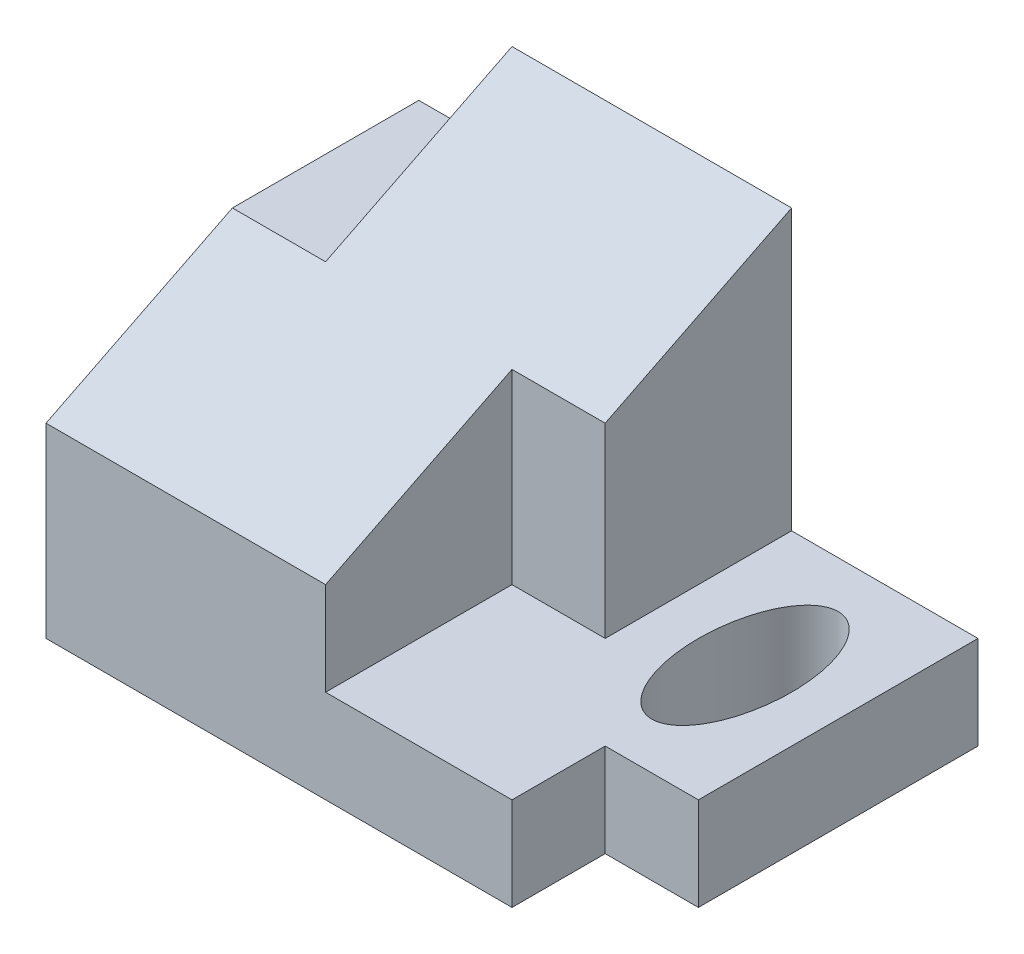
ISO-10303-21;
HEADER;
FILE_DESCRIPTION(('STEP AP214'),'2;1');
FILE_NAME('part.step','',(''),(''),'','','');
FILE_SCHEMA(('AUTOMOTIVE_DESIGN { 1 0 10303 214 1 1 1 1 }'));
ENDSEC;
DATA;
#1=APPLICATION_CONTEXT('core data for automotive mechanical design processes');
#2=APPLICATION_PROTOCOL_DEFINITION('international standard','automotive_design',2000,#1);
#3=PRODUCT_CONTEXT('',#1,'mechanical');
#4=PRODUCT('Part','Part','',(#3));
#5=PRODUCT_RELATED_PRODUCT_CATEGORY('part','',(#4));
#6=PRODUCT_DEFINITION_FORMATION('','',#4);
#7=PRODUCT_DEFINITION_CONTEXT('part definition',#1,'design');
#8=PRODUCT_DEFINITION('design','',#6,#7);
#9=PRODUCT_DEFINITION_SHAPE('','',#8);
#10=(LENGTH_UNIT() NAMED_UNIT(*) SI_UNIT(.MILLI.,.METRE.));
#11=(NAMED_UNIT(*) PLANE_ANGLE_UNIT() SI_UNIT($,.RADIAN.));
#12=(NAMED_UNIT(*) SI_UNIT($,.STERADIAN.) SOLID_ANGLE_UNIT());
#13=UNCERTAINTY_MEASURE_WITH_UNIT(LENGTH_MEASURE(1.E-05),#10,'distance_accuracy_value','');
#14=(GEOMETRIC_REPRESENTATION_CONTEXT(3) GLOBAL_UNCERTAINTY_ASSIGNED_CONTEXT((#13)) GLOBAL_UNIT_ASSIGNED_CONTEXT((#10,
#11,#12)) REPRESENTATION_CONTEXT('',''));
#15=CARTESIAN_POINT('',(0.,0.,0.));
#16=DIRECTION('',(0.,0.,1.));
#17=DIRECTION('',(1.,0.,0.));
#18=AXIS2_PLACEMENT_3D('',#15,#16,#17);
#19=CARTESIAN_POINT('',(76.2,-50.8,50.8));
#20=DIRECTION('',(-1.,0.,0.));
#21=DIRECTION('',(0.,0.,1.));
#22=AXIS2_PLACEMENT_3D('',#19,#20,#21);
#23=PLANE('',#22);
#24=DIRECTION('',(0.,0.,1.));
#25=VECTOR('',#24,1.);
#26=CARTESIAN_POINT('',(76.2,-25.4,-50.8));
#27=LINE('',#26,#25);
#28=CARTESIAN_POINT('',(76.2,-25.4,-50.8));
#29=VERTEX_POINT('',#28);
#30=CARTESIAN_POINT('',(76.2,-25.4,25.4));
#31=VERTEX_POINT('',#30);
#32=EDGE_CURVE('E226',#29,#31,#27,.T.);
#33=ORIENTED_EDGE('',*,*,#32,.T.);
#34=DIRECTION('',(0.,1.,0.));
#35=VECTOR('',#34,1.);
#36=CARTESIAN_POINT('',(76.2,-50.8,25.4));
#37=LINE('',#36,#35);
#38=CARTESIAN_POINT('',(76.2,-50.8,25.4));
#39=VERTEX_POINT('',#38);
#40=EDGE_CURVE('E198',#39,#31,#37,.T.);
#41=ORIENTED_EDGE('',*,*,#40,.F.);
#42=DIRECTION('',(0.,0.,-1.));
#43=VECTOR('',#42,1.);
#44=CARTESIAN_POINT('',(76.2,-50.8,50.8));
#45=LINE('',#44,#43);
#46=CARTESIAN_POINT('',(76.2,-50.8,-50.8));
#47=VERTEX_POINT('',#46);
#48=EDGE_CURVE('E242',#39,#47,#45,.T.);
#49=ORIENTED_EDGE('',*,*,#48,.T.);
#50=DIRECTION('',(0.,1.,0.));
#51=VECTOR('',#50,1.);
#52=CARTESIAN_POINT('',(76.2,-50.8,-50.8));
#53=LINE('',#52,#51);
#54=EDGE_CURVE('E230',#47,#29,#53,.T.);
#55=ORIENTED_EDGE('',*,*,#54,.T.);
#56=EDGE_LOOP('',(#33,#41,#49,#55));
#57=FACE_BOUND('',#56,.T.);
#58=ADVANCED_FACE('F46',(#57),#23,.F.);
#59=CARTESIAN_POINT('',(-76.2,-50.8,50.8));
#60=DIRECTION('',(1.,0.,0.));
#61=DIRECTION('',(0.,0.,-1.));
#62=AXIS2_PLACEMENT_3D('',#59,#60,#61);
#63=PLANE('',#62);
#64=DIRECTION('',(0.,-1.,0.));
#65=VECTOR('',#64,1.);
#66=CARTESIAN_POINT('',(-76.2,-50.8,50.8));
#67=LINE('',#66,#65);
#68=CARTESIAN_POINT('',(-76.2,-1.11022302462516E-13,50.8));
#69=VERTEX_POINT('',#68);
#70=CARTESIAN_POINT('',(-76.2,-50.8,50.8));
#71=VERTEX_POINT('',#70);
#72=EDGE_CURVE('E234',#69,#71,#67,.T.);
#73=ORIENTED_EDGE('',*,*,#72,.F.);
#74=DIRECTION('',(0.,-0.447213595499956,0.894427190999917));
#75=VECTOR('',#74,1.);
#76=CARTESIAN_POINT('',(-76.2,-1.11022302462516E-13,50.8));
#77=LINE('',#76,#75);
#78=CARTESIAN_POINT('',(-76.2,25.4,-4.57966997657877E-13));
#79=VERTEX_POINT('',#78);
#80=EDGE_CURVE('E264',#69,#79,#77,.F.);
#81=ORIENTED_EDGE('',*,*,#80,.T.);
#82=DIRECTION('',(0.,0.,-1.));
#83=VECTOR('',#82,1.);
#84=CARTESIAN_POINT('',(-76.2,25.4,50.8));
#85=LINE('',#84,#83);
#86=CARTESIAN_POINT('',(-76.2,25.4,-50.8));
#87=VERTEX_POINT('',#86);
#88=EDGE_CURVE('E149',#79,#87,#85,.T.);
#89=ORIENTED_EDGE('',*,*,#88,.T.);
#90=DIRECTION('',(0.,-1.,0.));
#91=VECTOR('',#90,1.);
#92=CARTESIAN_POINT('',(-76.2,-50.8,-50.8));
#93=LINE('',#92,#91);
#94=CARTESIAN_POINT('',(-76.2,-50.8,-50.8));
#95=VERTEX_POINT('',#94);
#96=EDGE_CURVE('E163',#87,#95,#93,.T.);
#97=ORIENTED_EDGE('',*,*,#96,.T.);
#98=DIRECTION('',(0.,0.,-1.));
#99=VECTOR('',#98,1.);
#100=CARTESIAN_POINT('',(-76.2,-50.8,50.8));
#101=LINE('',#100,#99);
#102=EDGE_CURVE('E256',#71,#95,#101,.T.);
#103=ORIENTED_EDGE('',*,*,#102,.F.);
#104=EDGE_LOOP('',(#73,#81,#89,#97,#103));
#105=FACE_BOUND('',#104,.T.);
#106=ADVANCED_FACE('F275',(#105),#63,.F.);
#107=CARTESIAN_POINT('',(-76.2,-50.8,50.8));
#108=DIRECTION('',(0.,1.,0.));
#109=DIRECTION('',(0.,0.,1.));
#110=AXIS2_PLACEMENT_3D('',#107,#108,#109);
#111=PLANE('',#110);
#112=CARTESIAN_POINT('',(50.8,-50.8,-12.7));
#113=DIRECTION('',(0.,1.,0.));
#114=DIRECTION('',(0.,0.,1.));
#115=AXIS2_PLACEMENT_3D('',#112,#113,#114);
#116=ELLIPSE('',#115,25.4,12.7);
#117=CARTESIAN_POINT('',(50.8,-50.8,12.7));
#118=VERTEX_POINT('',#117);
#119=EDGE_CURVE('E159',#118,#118,#116,.T.);
#120=ORIENTED_EDGE('',*,*,#119,.T.);
#121=EDGE_LOOP('',(#120));
#122=FACE_BOUND('',#121,.T.);
#123=DIRECTION('',(-1.,0.,0.));
#124=VECTOR('',#123,1.);
#125=CARTESIAN_POINT('',(76.2,-50.8,25.4));
#126=LINE('',#125,#124);
#127=CARTESIAN_POINT('',(50.8,-50.8,25.4));
#128=VERTEX_POINT('',#127);
#129=EDGE_CURVE('E189',#39,#128,#126,.T.);
#130=ORIENTED_EDGE('',*,*,#129,.T.);
#131=DIRECTION('',(0.,0.,1.));
#132=VECTOR('',#131,1.);
#133=CARTESIAN_POINT('',(50.8,-50.8,50.8));
#134=LINE('',#133,#132);
#135=CARTESIAN_POINT('',(50.8,-50.8,50.8));
#136=VERTEX_POINT('',#135);
#137=EDGE_CURVE('E193',#128,#136,#134,.T.);
#138=ORIENTED_EDGE('',*,*,#137,.T.);
#139=DIRECTION('',(1.,0.,0.));
#140=VECTOR('',#139,1.);
#141=CARTESIAN_POINT('',(-76.2,-50.8,50.8));
#142=LINE('',#141,#140);
#143=EDGE_CURVE('E237',#71,#136,#142,.T.);
#144=ORIENTED_EDGE('',*,*,#143,.F.);
#145=ORIENTED_EDGE('',*,*,#102,.T.);
#146=DIRECTION('',(1.,0.,0.));
#147=VECTOR('',#146,1.);
#148=CARTESIAN_POINT('',(-76.2,-50.8,-50.8));
#149=LINE('',#148,#147);
#150=EDGE_CURVE('E238',#95,#47,#149,.T.);
#151=ORIENTED_EDGE('',*,*,#150,.T.);
#152=ORIENTED_EDGE('',*,*,#48,.F.);
#153=EDGE_LOOP('',(#130,#138,#144,#145,#151,#152));
#154=FACE_BOUND('',#153,.T.);
#155=ADVANCED_FACE('F290',(#122,#154),#111,.F.);
#156=CARTESIAN_POINT('',(0.,0.,50.8));
#157=DIRECTION('',(0.,0.,-1.));
#158=DIRECTION('',(-1.,0.,0.));
#159=AXIS2_PLACEMENT_3D('',#156,#157,#158);
#160=PLANE('',#159);
#161=DIRECTION('',(0.,1.,0.));
#162=VECTOR('',#161,1.);
#163=CARTESIAN_POINT('',(0.,-82.1961266284947,50.8));
#164=LINE('',#163,#162);
#165=CARTESIAN_POINT('',(0.,-25.4,50.8));
#166=VERTEX_POINT('',#165);
#167=CARTESIAN_POINT('',(0.,-1.11022302462516E-13,50.8));
#168=VERTEX_POINT('',#167);
#169=EDGE_CURVE('E179',#166,#168,#164,.T.);
#170=ORIENTED_EDGE('',*,*,#169,.T.);
#171=DIRECTION('',(-1.,0.,0.));
#172=VECTOR('',#171,1.);
#173=CARTESIAN_POINT('',(0.,-1.11022302462516E-13,50.8));
#174=LINE('',#173,#172);
#175=EDGE_CURVE('E260',#168,#69,#174,.T.);
#176=ORIENTED_EDGE('',*,*,#175,.T.);
#177=ORIENTED_EDGE('',*,*,#72,.T.);
#178=ORIENTED_EDGE('',*,*,#143,.T.);
#179=DIRECTION('',(0.,1.,0.));
#180=VECTOR('',#179,1.);
#181=CARTESIAN_POINT('',(50.8,-50.8,50.8));
#182=LINE('',#181,#180);
#183=CARTESIAN_POINT('',(50.8,-25.4,50.8));
#184=VERTEX_POINT('',#183);
#185=EDGE_CURVE('E204',#136,#184,#182,.T.);
#186=ORIENTED_EDGE('',*,*,#185,.T.);
#187=DIRECTION('',(1.,0.,0.));
#188=VECTOR('',#187,1.);
#189=CARTESIAN_POINT('',(76.2,-25.4,50.8));
#190=LINE('',#189,#188);
#191=EDGE_CURVE('E208',#166,#184,#190,.T.);
#192=ORIENTED_EDGE('',*,*,#191,.F.);
#193=EDGE_LOOP('',(#170,#176,#177,#178,#186,#192));
#194=FACE_BOUND('',#193,.T.);
#195=ADVANCED_FACE('F294',(#194),#160,.F.);
#196=CARTESIAN_POINT('',(0.,0.,-50.8));
#197=DIRECTION('',(0.,0.,-1.));
#198=DIRECTION('',(-1.,0.,0.));
#199=AXIS2_PLACEMENT_3D('',#196,#197,#198);
#200=PLANE('',#199);
#201=DIRECTION('',(-1.,0.,0.));
#202=VECTOR('',#201,1.);
#203=CARTESIAN_POINT('',(-76.2,25.4,-50.8));
#204=LINE('',#203,#202);
#205=CARTESIAN_POINT('',(-50.8,25.4,-50.8));
#206=VERTEX_POINT('',#205);
#207=EDGE_CURVE('E142',#206,#87,#204,.T.);
#208=ORIENTED_EDGE('',*,*,#207,.F.);
#209=DIRECTION('',(0.,-1.,0.));
#210=VECTOR('',#209,1.);
#211=CARTESIAN_POINT('',(-50.8,50.8,-50.8));
#212=LINE('',#211,#210);
#213=CARTESIAN_POINT('',(-50.8,50.8,-50.8));
#214=VERTEX_POINT('',#213);
#215=EDGE_CURVE('E152',#214,#206,#212,.T.);
#216=ORIENTED_EDGE('',*,*,#215,.F.);
#217=DIRECTION('',(-1.,0.,0.));
#218=VECTOR('',#217,1.);
#219=CARTESIAN_POINT('',(-76.2,50.8,-50.8));
#220=LINE('',#219,#218);
#221=CARTESIAN_POINT('',(25.4,50.8,-50.8));
#222=VERTEX_POINT('',#221);
#223=EDGE_CURVE('E246',#222,#214,#220,.T.);
#224=ORIENTED_EDGE('',*,*,#223,.F.);
#225=DIRECTION('',(0.,-1.,0.));
#226=VECTOR('',#225,1.);
#227=CARTESIAN_POINT('',(25.4,50.8,-50.8));
#228=LINE('',#227,#226);
#229=CARTESIAN_POINT('',(25.4,-25.4,-50.8));
#230=VERTEX_POINT('',#229);
#231=EDGE_CURVE('E214',#222,#230,#228,.T.);
#232=ORIENTED_EDGE('',*,*,#231,.T.);
#233=DIRECTION('',(1.,0.,0.));
#234=VECTOR('',#233,1.);
#235=CARTESIAN_POINT('',(76.2,-25.4,-50.8));
#236=LINE('',#235,#234);
#237=EDGE_CURVE('E218',#230,#29,#236,.T.);
#238=ORIENTED_EDGE('',*,*,#237,.T.);
#239=ORIENTED_EDGE('',*,*,#54,.F.);
#240=ORIENTED_EDGE('',*,*,#150,.F.);
#241=ORIENTED_EDGE('',*,*,#96,.F.);
#242=EDGE_LOOP('',(#208,#216,#224,#232,#238,#239,#240,#241));
#243=FACE_BOUND('',#242,.T.);
#244=ADVANCED_FACE('F161',(#243),#200,.T.);
#245=CARTESIAN_POINT('',(76.2,-25.4,-50.8));
#246=DIRECTION('',(0.,-1.,0.));
#247=DIRECTION('',(1.,0.,0.));
#248=AXIS2_PLACEMENT_3D('',#245,#246,#247);
#249=PLANE('',#248);
#250=CARTESIAN_POINT('',(50.8,-25.4,-12.7));
#251=DIRECTION('',(0.,1.,0.));
#252=DIRECTION('',(0.,0.,1.));
#253=AXIS2_PLACEMENT_3D('',#250,#251,#252);
#254=ELLIPSE('',#253,25.4,12.7);
#255=CARTESIAN_POINT('',(50.8,-25.4,12.7));
#256=VERTEX_POINT('',#255);
#257=EDGE_CURVE('E421',#256,#256,#254,.T.);
#258=ORIENTED_EDGE('',*,*,#257,.F.);
#259=EDGE_LOOP('',(#258));
#260=FACE_BOUND('',#259,.T.);
#261=ORIENTED_EDGE('',*,*,#191,.T.);
#262=DIRECTION('',(0.,0.,1.));
#263=VECTOR('',#262,1.);
#264=CARTESIAN_POINT('',(50.8,-25.4,50.8));
#265=LINE('',#264,#263);
#266=CARTESIAN_POINT('',(50.8,-25.4,25.4));
#267=VERTEX_POINT('',#266);
#268=EDGE_CURVE('E194',#267,#184,#265,.T.);
#269=ORIENTED_EDGE('',*,*,#268,.F.);
#270=DIRECTION('',(-1.,0.,0.));
#271=VECTOR('',#270,1.);
#272=CARTESIAN_POINT('',(76.2,-25.4,25.4));
#273=LINE('',#272,#271);
#274=EDGE_CURVE('E188',#31,#267,#273,.T.);
#275=ORIENTED_EDGE('',*,*,#274,.F.);
#276=ORIENTED_EDGE('',*,*,#32,.F.);
#277=ORIENTED_EDGE('',*,*,#237,.F.);
#278=DIRECTION('',(0.,0.,1.));
#279=VECTOR('',#278,1.);
#280=CARTESIAN_POINT('',(25.4,-25.4,-50.8));
#281=LINE('',#280,#279);
#282=CARTESIAN_POINT('',(25.4,-25.4,0.));
#283=VERTEX_POINT('',#282);
#284=EDGE_CURVE('E222',#230,#283,#281,.T.);
#285=ORIENTED_EDGE('',*,*,#284,.T.);
#286=DIRECTION('',(-1.,0.,0.));
#287=VECTOR('',#286,1.);
#288=CARTESIAN_POINT('',(25.4,-25.4,0.));
#289=LINE('',#288,#287);
#290=CARTESIAN_POINT('',(0.,-25.4,0.));
#291=VERTEX_POINT('',#290);
#292=EDGE_CURVE('E169',#283,#291,#289,.T.);
#293=ORIENTED_EDGE('',*,*,#292,.T.);
#294=DIRECTION('',(0.,0.,1.));
#295=VECTOR('',#294,1.);
#296=CARTESIAN_POINT('',(0.,-25.4,50.8));
#297=LINE('',#296,#295);
#298=EDGE_CURVE('E175',#291,#166,#297,.T.);
#299=ORIENTED_EDGE('',*,*,#298,.T.);
#300=EDGE_LOOP('',(#261,#269,#275,#276,#277,#285,#293,#299));
#301=FACE_BOUND('',#300,.T.);
#302=ADVANCED_FACE('F283',(#260,#301),#249,.F.);
#303=CARTESIAN_POINT('',(25.4,50.8,-50.8));
#304=DIRECTION('',(-1.,0.,0.));
#305=DIRECTION('',(0.,-1.,0.));
#306=AXIS2_PLACEMENT_3D('',#303,#304,#305);
#307=PLANE('',#306);
#308=ORIENTED_EDGE('',*,*,#231,.F.);
#309=DIRECTION('',(0.,0.447213595499956,-0.894427190999917));
#310=VECTOR('',#309,1.);
#311=CARTESIAN_POINT('',(25.4,-1.10097116608661E-13,50.8));
#312=LINE('',#311,#310);
#313=CARTESIAN_POINT('',(25.4,25.3999999999998,0.));
#314=VERTEX_POINT('',#313);
#315=EDGE_CURVE('E70',#222,#314,#312,.F.);
#316=ORIENTED_EDGE('',*,*,#315,.T.);
#317=DIRECTION('',(0.,1.,0.));
#318=VECTOR('',#317,1.);
#319=CARTESIAN_POINT('',(25.4,-82.1961266284947,0.));
#320=LINE('',#319,#318);
#321=EDGE_CURVE('E183',#283,#314,#320,.T.);
#322=ORIENTED_EDGE('',*,*,#321,.F.);
#323=ORIENTED_EDGE('',*,*,#284,.F.);
#324=EDGE_LOOP('',(#308,#316,#322,#323));
#325=FACE_BOUND('',#324,.T.);
#326=ADVANCED_FACE('F281',(#325),#307,.F.);
#327=CARTESIAN_POINT('',(50.8,-50.8,50.8));
#328=DIRECTION('',(-1.,0.,0.));
#329=DIRECTION('',(0.,-1.,0.));
#330=AXIS2_PLACEMENT_3D('',#327,#328,#329);
#331=PLANE('',#330);
#332=ORIENTED_EDGE('',*,*,#268,.T.);
#333=ORIENTED_EDGE('',*,*,#185,.F.);
#334=ORIENTED_EDGE('',*,*,#137,.F.);
#335=DIRECTION('',(0.,1.,0.));
#336=VECTOR('',#335,1.);
#337=CARTESIAN_POINT('',(50.8,-50.8,25.4));
#338=LINE('',#337,#336);
#339=EDGE_CURVE('E209',#128,#267,#338,.T.);
#340=ORIENTED_EDGE('',*,*,#339,.T.);
#341=EDGE_LOOP('',(#332,#333,#334,#340));
#342=FACE_BOUND('',#341,.T.);
#343=ADVANCED_FACE('F309',(#342),#331,.F.);
#344=CARTESIAN_POINT('',(76.2,-50.8,25.4));
#345=DIRECTION('',(0.,0.,-1.));
#346=DIRECTION('',(-1.,0.,0.));
#347=AXIS2_PLACEMENT_3D('',#344,#345,#346);
#348=PLANE('',#347);
#349=ORIENTED_EDGE('',*,*,#274,.T.);
#350=ORIENTED_EDGE('',*,*,#339,.F.);
#351=ORIENTED_EDGE('',*,*,#129,.F.);
#352=ORIENTED_EDGE('',*,*,#40,.T.);
#353=EDGE_LOOP('',(#349,#350,#351,#352));
#354=FACE_BOUND('',#353,.T.);
#355=ADVANCED_FACE('F301',(#354),#348,.F.);
#356=CARTESIAN_POINT('',(25.4,-82.1961266284947,0.));
#357=DIRECTION('',(0.,0.,-1.));
#358=DIRECTION('',(-1.,0.,0.));
#359=AXIS2_PLACEMENT_3D('',#356,#357,#358);
#360=PLANE('',#359);
#361=ORIENTED_EDGE('',*,*,#321,.T.);
#362=DIRECTION('',(1.,0.,0.));
#363=VECTOR('',#362,1.);
#364=CARTESIAN_POINT('',(0.,25.3999999999998,0.));
#365=LINE('',#364,#363);
#366=CARTESIAN_POINT('',(0.,25.3999999999998,0.));
#367=VERTEX_POINT('',#366);
#368=EDGE_CURVE('E56',#314,#367,#365,.F.);
#369=ORIENTED_EDGE('',*,*,#368,.T.);
#370=DIRECTION('',(0.,1.,0.));
#371=VECTOR('',#370,1.);
#372=CARTESIAN_POINT('',(0.,-82.1961266284947,0.));
#373=LINE('',#372,#371);
#374=EDGE_CURVE('E174',#291,#367,#373,.T.);
#375=ORIENTED_EDGE('',*,*,#374,.F.);
#376=ORIENTED_EDGE('',*,*,#292,.F.);
#377=EDGE_LOOP('',(#361,#369,#375,#376));
#378=FACE_BOUND('',#377,.T.);
#379=ADVANCED_FACE('F299',(#378),#360,.F.);
#380=CARTESIAN_POINT('',(0.,-82.1961266284947,50.8));
#381=DIRECTION('',(-1.,0.,0.));
#382=DIRECTION('',(0.,0.,1.));
#383=AXIS2_PLACEMENT_3D('',#380,#381,#382);
#384=PLANE('',#383);
#385=ORIENTED_EDGE('',*,*,#374,.T.);
#386=DIRECTION('',(0.,0.447213595499956,-0.894427190999917));
#387=VECTOR('',#386,1.);
#388=CARTESIAN_POINT('',(0.,-1.11022302462516E-13,50.8));
#389=LINE('',#388,#387);
#390=EDGE_CURVE('E11',#367,#168,#389,.F.);
#391=ORIENTED_EDGE('',*,*,#390,.T.);
#392=ORIENTED_EDGE('',*,*,#169,.F.);
#393=ORIENTED_EDGE('',*,*,#298,.F.);
#394=EDGE_LOOP('',(#385,#391,#392,#393));
#395=FACE_BOUND('',#394,.T.);
#396=ADVANCED_FACE('F298',(#395),#384,.F.);
#397=CARTESIAN_POINT('',(-76.2,25.4,50.8));
#398=DIRECTION('',(0.,-1.,0.));
#399=DIRECTION('',(0.,0.,-1.));
#400=AXIS2_PLACEMENT_3D('',#397,#398,#399);
#401=PLANE('',#400);
#402=ORIENTED_EDGE('',*,*,#88,.F.);
#403=DIRECTION('',(-1.,0.,0.));
#404=VECTOR('',#403,1.);
#405=CARTESIAN_POINT('',(0.,25.4,-4.57966997657877E-13));
#406=LINE('',#405,#404);
#407=CARTESIAN_POINT('',(-50.8,25.4,-4.57966997657877E-13));
#408=VERTEX_POINT('',#407);
#409=EDGE_CURVE('E145',#79,#408,#406,.F.);
#410=ORIENTED_EDGE('',*,*,#409,.T.);
#411=DIRECTION('',(0.,0.,-1.));
#412=VECTOR('',#411,1.);
#413=CARTESIAN_POINT('',(-50.8,25.4,50.8));
#414=LINE('',#413,#412);
#415=EDGE_CURVE('E137',#408,#206,#414,.T.);
#416=ORIENTED_EDGE('',*,*,#415,.T.);
#417=ORIENTED_EDGE('',*,*,#207,.T.);
#418=EDGE_LOOP('',(#402,#410,#416,#417));
#419=FACE_BOUND('',#418,.T.);
#420=ADVANCED_FACE('F140',(#419),#401,.F.);
#421=CARTESIAN_POINT('',(-50.8,50.8,50.8));
#422=DIRECTION('',(1.,0.,0.));
#423=DIRECTION('',(0.,1.,0.));
#424=AXIS2_PLACEMENT_3D('',#421,#422,#423);
#425=PLANE('',#424);
#426=ORIENTED_EDGE('',*,*,#415,.F.);
#427=DIRECTION('',(0.,-0.447213595499956,0.894427190999917));
#428=VECTOR('',#427,1.);
#429=CARTESIAN_POINT('',(-50.8,-1.08246744900953E-13,50.8));
#430=LINE('',#429,#428);
#431=EDGE_CURVE('E154',#408,#214,#430,.F.);
#432=ORIENTED_EDGE('',*,*,#431,.T.);
#433=ORIENTED_EDGE('',*,*,#215,.T.);
#434=EDGE_LOOP('',(#426,#432,#433));
#435=FACE_BOUND('',#434,.T.);
#436=ADVANCED_FACE('F153',(#435),#425,.F.);
#437=CARTESIAN_POINT('',(0.,-1.11022302462516E-13,50.8));
#438=DIRECTION('',(0.,-0.894427190999917,-0.447213595499956));
#439=DIRECTION('',(-1.,0.,0.));
#440=AXIS2_PLACEMENT_3D('',#437,#438,#439);
#441=PLANE('',#440);
#442=ORIENTED_EDGE('',*,*,#315,.F.);
#443=ORIENTED_EDGE('',*,*,#223,.T.);
#444=ORIENTED_EDGE('',*,*,#431,.F.);
#445=ORIENTED_EDGE('',*,*,#409,.F.);
#446=ORIENTED_EDGE('',*,*,#80,.F.);
#447=ORIENTED_EDGE('',*,*,#175,.F.);
#448=ORIENTED_EDGE('',*,*,#390,.F.);
#449=ORIENTED_EDGE('',*,*,#368,.F.);
#450=EDGE_LOOP('',(#442,#443,#444,#445,#446,#447,#448,#449));
#451=FACE_BOUND('',#450,.T.);
#452=ADVANCED_FACE('F49',(#451),#441,.F.);
#453=DIRECTION('',(0.,1.,0.));
#454=VECTOR('',#453,1.);
#455=SURFACE_OF_LINEAR_EXTRUSION('',#116,#454);
#456=ORIENTED_EDGE('',*,*,#119,.F.);
#457=EDGE_LOOP('',(#456));
#458=FACE_BOUND('',#457,.T.);
#459=ORIENTED_EDGE('',*,*,#257,.T.);
#460=EDGE_LOOP('',(#459));
#461=FACE_BOUND('',#460,.T.);
#462=ADVANCED_FACE('F405',(#458,#461),#455,.F.);
#463=CLOSED_SHELL('',(#58,#106,#155,#195,#244,#302,#326,#343,#355,#379,#396,#420,#436,#452,#462));
#464=MANIFOLD_SOLID_BREP('B2',#463);
#465=ADVANCED_BREP_SHAPE_REPRESENTATION('',(#18,#464),#14);
#466=SHAPE_DEFINITION_REPRESENTATION(#9,#465);
ENDSEC;
END-ISO-10303-21;
